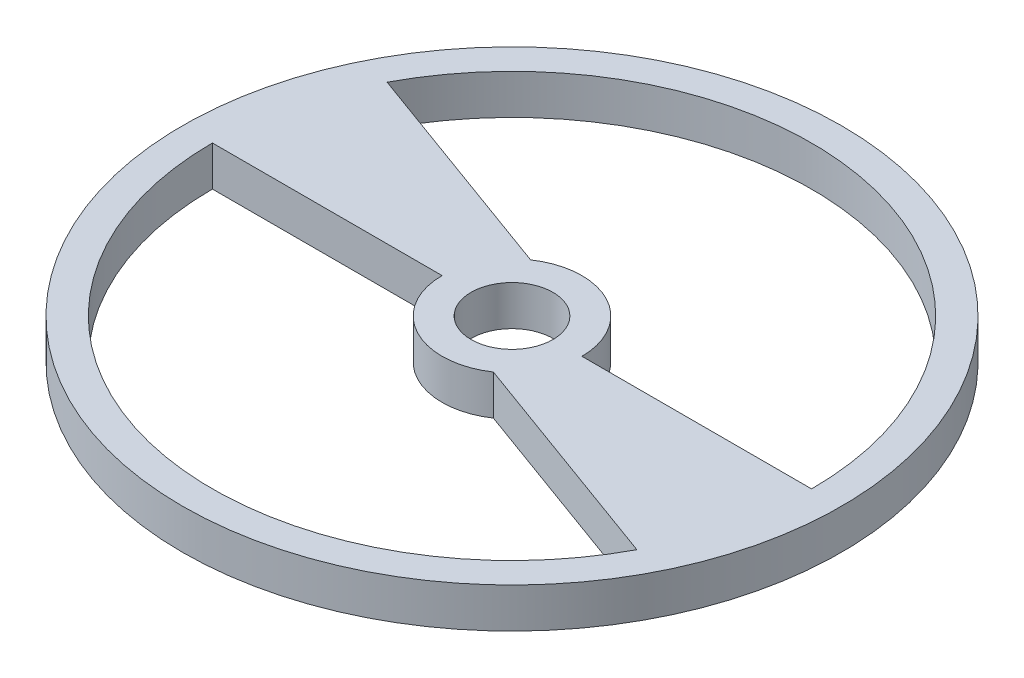
ISO-10303-21;
HEADER;
FILE_DESCRIPTION(('STEP AP214'),'2;1');
FILE_NAME('part.step','',(''),(''),'','','');
FILE_SCHEMA(('AUTOMOTIVE_DESIGN { 1 0 10303 214 1 1 1 1 }'));
ENDSEC;
DATA;
#1=APPLICATION_CONTEXT('core data for automotive mechanical design processes');
#2=APPLICATION_PROTOCOL_DEFINITION('international standard','automotive_design',2000,#1);
#3=PRODUCT_CONTEXT('',#1,'mechanical');
#4=PRODUCT('Part','Part','',(#3));
#5=PRODUCT_RELATED_PRODUCT_CATEGORY('part','',(#4));
#6=PRODUCT_DEFINITION_FORMATION('','',#4);
#7=PRODUCT_DEFINITION_CONTEXT('part definition',#1,'design');
#8=PRODUCT_DEFINITION('design','',#6,#7);
#9=PRODUCT_DEFINITION_SHAPE('','',#8);
#10=(LENGTH_UNIT() NAMED_UNIT(*) SI_UNIT(.MILLI.,.METRE.));
#11=(NAMED_UNIT(*) PLANE_ANGLE_UNIT() SI_UNIT($,.RADIAN.));
#12=(NAMED_UNIT(*) SI_UNIT($,.STERADIAN.) SOLID_ANGLE_UNIT());
#13=UNCERTAINTY_MEASURE_WITH_UNIT(LENGTH_MEASURE(1.E-05),#10,'distance_accuracy_value','');
#14=(GEOMETRIC_REPRESENTATION_CONTEXT(3) GLOBAL_UNCERTAINTY_ASSIGNED_CONTEXT((#13)) GLOBAL_UNIT_ASSIGNED_CONTEXT((#10,
#11,#12)) REPRESENTATION_CONTEXT('',''));
#15=CARTESIAN_POINT('',(0.,0.,0.));
#16=DIRECTION('',(0.,0.,1.));
#17=DIRECTION('',(1.,0.,0.));
#18=AXIS2_PLACEMENT_3D('',#15,#16,#17);
#19=CARTESIAN_POINT('',(0.,2.,0.));
#20=DIRECTION('',(0.,1.,0.));
#21=DIRECTION('',(0.,0.,1.));
#22=AXIS2_PLACEMENT_3D('',#19,#20,#21);
#23=PLANE('',#22);
#24=CARTESIAN_POINT('',(0.,2.,0.));
#25=DIRECTION('',(0.,1.,0.));
#26=DIRECTION('',(0.,0.,1.));
#27=AXIS2_PLACEMENT_3D('',#24,#25,#26);
#28=CIRCLE('',#27,16.5);
#29=CARTESIAN_POINT('',(0.,2.,16.5));
#30=VERTEX_POINT('',#29);
#31=EDGE_CURVE('E11',#30,#30,#28,.T.);
#32=ORIENTED_EDGE('',*,*,#31,.T.);
#33=EDGE_LOOP('',(#32));
#34=FACE_BOUND('',#33,.T.);
#35=CARTESIAN_POINT('',(0.,2.,0.));
#36=DIRECTION('',(0.,1.,0.));
#37=DIRECTION('',(0.,0.,1.));
#38=AXIS2_PLACEMENT_3D('',#35,#36,#37);
#39=CIRCLE('',#38,2.05);
#40=CARTESIAN_POINT('',(0.,2.,2.05));
#41=VERTEX_POINT('',#40);
#42=EDGE_CURVE('E169',#41,#41,#39,.T.);
#43=ORIENTED_EDGE('',*,*,#42,.F.);
#44=EDGE_LOOP('',(#43));
#45=FACE_BOUND('',#44,.T.);
#46=DIRECTION('',(-1.,0.,0.));
#47=VECTOR('',#46,1.);
#48=CARTESIAN_POINT('',(-3.5,2.,0.));
#49=LINE('',#48,#47);
#50=CARTESIAN_POINT('',(-3.5,2.,0.));
#51=VERTEX_POINT('',#50);
#52=CARTESIAN_POINT('',(-15.,2.,0.));
#53=VERTEX_POINT('',#52);
#54=EDGE_CURVE('E140',#51,#53,#49,.T.);
#55=ORIENTED_EDGE('',*,*,#54,.F.);
#56=CARTESIAN_POINT('',(0.,2.,0.));
#57=DIRECTION('',(0.,-1.,0.));
#58=DIRECTION('',(0.,0.,1.));
#59=AXIS2_PLACEMENT_3D('',#56,#57,#58);
#60=CIRCLE('',#59,3.5);
#61=CARTESIAN_POINT('',(1.96458962433597,2.,2.89661657938213));
#62=VERTEX_POINT('',#61);
#63=EDGE_CURVE('E138',#62,#51,#60,.T.);
#64=ORIENTED_EDGE('',*,*,#63,.F.);
#65=DIRECTION('',(-0.939692620785908,0.,-0.342020143325669));
#66=VECTOR('',#65,1.);
#67=CARTESIAN_POINT('',(1.96458962433597,2.,2.89661657938213));
#68=LINE('',#67,#66);
#69=CARTESIAN_POINT('',(13.2619922715674,2.,7.00853486749457));
#70=VERTEX_POINT('',#69);
#71=EDGE_CURVE('E146',#70,#62,#68,.T.);
#72=ORIENTED_EDGE('',*,*,#71,.F.);
#73=CARTESIAN_POINT('',(0.,2.,0.));
#74=DIRECTION('',(0.,1.,0.));
#75=DIRECTION('',(0.,0.,1.));
#76=AXIS2_PLACEMENT_3D('',#73,#74,#75);
#77=CIRCLE('',#76,15.);
#78=EDGE_CURVE('E143',#53,#70,#77,.T.);
#79=ORIENTED_EDGE('',*,*,#78,.F.);
#80=EDGE_LOOP('',(#55,#64,#72,#79));
#81=FACE_BOUND('',#80,.T.);
#82=DIRECTION('',(0.939692620785911,0.,0.342020143325663));
#83=VECTOR('',#82,1.);
#84=CARTESIAN_POINT('',(-13.2619922715674,2.,-7.00853486749448));
#85=LINE('',#84,#83);
#86=CARTESIAN_POINT('',(-13.2619922715674,2.,-7.00853486749448));
#87=VERTEX_POINT('',#86);
#88=CARTESIAN_POINT('',(-1.96458962433599,2.,-2.89661657938212));
#89=VERTEX_POINT('',#88);
#90=EDGE_CURVE('E110',#87,#89,#85,.T.);
#91=ORIENTED_EDGE('',*,*,#90,.F.);
#92=CARTESIAN_POINT('',(0.,2.,0.));
#93=DIRECTION('',(0.,1.,0.));
#94=DIRECTION('',(0.,0.,1.));
#95=AXIS2_PLACEMENT_3D('',#92,#93,#94);
#96=CIRCLE('',#95,15.);
#97=CARTESIAN_POINT('',(15.,2.,0.));
#98=VERTEX_POINT('',#97);
#99=EDGE_CURVE('E102',#98,#87,#96,.T.);
#100=ORIENTED_EDGE('',*,*,#99,.F.);
#101=DIRECTION('',(1.,0.,0.));
#102=VECTOR('',#101,1.);
#103=CARTESIAN_POINT('',(3.5,2.,0.));
#104=LINE('',#103,#102);
#105=CARTESIAN_POINT('',(3.5,2.,0.));
#106=VERTEX_POINT('',#105);
#107=EDGE_CURVE('E124',#106,#98,#104,.T.);
#108=ORIENTED_EDGE('',*,*,#107,.F.);
#109=CARTESIAN_POINT('',(0.,2.,0.));
#110=DIRECTION('',(0.,-1.,0.));
#111=DIRECTION('',(0.,0.,1.));
#112=AXIS2_PLACEMENT_3D('',#109,#110,#111);
#113=CIRCLE('',#112,3.5);
#114=EDGE_CURVE('E122',#89,#106,#113,.T.);
#115=ORIENTED_EDGE('',*,*,#114,.F.);
#116=EDGE_LOOP('',(#91,#100,#108,#115));
#117=FACE_BOUND('',#116,.T.);
#118=ADVANCED_FACE('F37',(#34,#45,#81,#117),#23,.T.);
#119=CARTESIAN_POINT('',(0.,0.,0.));
#120=DIRECTION('',(0.,1.,0.));
#121=DIRECTION('',(0.,0.,1.));
#122=AXIS2_PLACEMENT_3D('',#119,#120,#121);
#123=PLANE('',#122);
#124=CARTESIAN_POINT('',(0.,0.,0.));
#125=DIRECTION('',(0.,-1.,0.));
#126=DIRECTION('',(0.,0.,1.));
#127=AXIS2_PLACEMENT_3D('',#124,#125,#126);
#128=CIRCLE('',#127,3.5);
#129=CARTESIAN_POINT('',(1.96458962433597,0.,2.89661657938213));
#130=VERTEX_POINT('',#129);
#131=CARTESIAN_POINT('',(-3.5,0.,0.));
#132=VERTEX_POINT('',#131);
#133=EDGE_CURVE('E118',#130,#132,#128,.T.);
#134=ORIENTED_EDGE('',*,*,#133,.T.);
#135=DIRECTION('',(-1.,0.,0.));
#136=VECTOR('',#135,1.);
#137=CARTESIAN_POINT('',(-3.5,0.,0.));
#138=LINE('',#137,#136);
#139=CARTESIAN_POINT('',(-15.,0.,0.));
#140=VERTEX_POINT('',#139);
#141=EDGE_CURVE('E151',#132,#140,#138,.T.);
#142=ORIENTED_EDGE('',*,*,#141,.T.);
#143=CARTESIAN_POINT('',(0.,0.,0.));
#144=DIRECTION('',(0.,1.,0.));
#145=DIRECTION('',(0.,0.,1.));
#146=AXIS2_PLACEMENT_3D('',#143,#144,#145);
#147=CIRCLE('',#146,15.);
#148=CARTESIAN_POINT('',(13.2619922715674,0.,7.00853486749457));
#149=VERTEX_POINT('',#148);
#150=EDGE_CURVE('E154',#140,#149,#147,.T.);
#151=ORIENTED_EDGE('',*,*,#150,.T.);
#152=DIRECTION('',(-0.939692620785908,0.,-0.342020143325669));
#153=VECTOR('',#152,1.);
#154=CARTESIAN_POINT('',(1.96458962433597,0.,2.89661657938213));
#155=LINE('',#154,#153);
#156=EDGE_CURVE('E141',#149,#130,#155,.T.);
#157=ORIENTED_EDGE('',*,*,#156,.T.);
#158=EDGE_LOOP('',(#134,#142,#151,#157));
#159=FACE_BOUND('',#158,.T.);
#160=CARTESIAN_POINT('',(0.,0.,0.));
#161=DIRECTION('',(0.,1.,0.));
#162=DIRECTION('',(0.,0.,1.));
#163=AXIS2_PLACEMENT_3D('',#160,#161,#162);
#164=CIRCLE('',#163,16.5);
#165=CARTESIAN_POINT('',(0.,0.,16.5));
#166=VERTEX_POINT('',#165);
#167=EDGE_CURVE('E41',#166,#166,#164,.T.);
#168=ORIENTED_EDGE('',*,*,#167,.F.);
#169=EDGE_LOOP('',(#168));
#170=FACE_BOUND('',#169,.T.);
#171=CARTESIAN_POINT('',(0.,0.,0.));
#172=DIRECTION('',(0.,1.,0.));
#173=DIRECTION('',(0.,0.,1.));
#174=AXIS2_PLACEMENT_3D('',#171,#172,#173);
#175=CIRCLE('',#174,2.05);
#176=CARTESIAN_POINT('',(0.,0.,2.05));
#177=VERTEX_POINT('',#176);
#178=EDGE_CURVE('E168',#177,#177,#175,.T.);
#179=ORIENTED_EDGE('',*,*,#178,.T.);
#180=EDGE_LOOP('',(#179));
#181=FACE_BOUND('',#180,.T.);
#182=CARTESIAN_POINT('',(0.,0.,0.));
#183=DIRECTION('',(0.,1.,0.));
#184=DIRECTION('',(0.,0.,1.));
#185=AXIS2_PLACEMENT_3D('',#182,#183,#184);
#186=CIRCLE('',#185,15.);
#187=CARTESIAN_POINT('',(15.,0.,0.));
#188=VERTEX_POINT('',#187);
#189=CARTESIAN_POINT('',(-13.2619922715674,0.,-7.00853486749448));
#190=VERTEX_POINT('',#189);
#191=EDGE_CURVE('E60',#188,#190,#186,.T.);
#192=ORIENTED_EDGE('',*,*,#191,.T.);
#193=DIRECTION('',(0.939692620785911,0.,0.342020143325663));
#194=VECTOR('',#193,1.);
#195=CARTESIAN_POINT('',(-13.2619922715674,0.,-7.00853486749448));
#196=LINE('',#195,#194);
#197=CARTESIAN_POINT('',(-1.96458962433599,0.,-2.89661657938212));
#198=VERTEX_POINT('',#197);
#199=EDGE_CURVE('E117',#190,#198,#196,.T.);
#200=ORIENTED_EDGE('',*,*,#199,.T.);
#201=CARTESIAN_POINT('',(0.,0.,0.));
#202=DIRECTION('',(0.,-1.,0.));
#203=DIRECTION('',(0.,0.,1.));
#204=AXIS2_PLACEMENT_3D('',#201,#202,#203);
#205=CIRCLE('',#204,3.5);
#206=CARTESIAN_POINT('',(3.5,0.,0.));
#207=VERTEX_POINT('',#206);
#208=EDGE_CURVE('E130',#198,#207,#205,.T.);
#209=ORIENTED_EDGE('',*,*,#208,.T.);
#210=DIRECTION('',(1.,0.,0.));
#211=VECTOR('',#210,1.);
#212=CARTESIAN_POINT('',(3.5,0.,0.));
#213=LINE('',#212,#211);
#214=EDGE_CURVE('E111',#207,#188,#213,.T.);
#215=ORIENTED_EDGE('',*,*,#214,.T.);
#216=EDGE_LOOP('',(#192,#200,#209,#215));
#217=FACE_BOUND('',#216,.T.);
#218=ADVANCED_FACE('F175',(#159,#170,#181,#217),#123,.F.);
#219=CARTESIAN_POINT('',(0.,2.,0.));
#220=DIRECTION('',(0.,-1.,0.));
#221=DIRECTION('',(0.,0.,-1.));
#222=AXIS2_PLACEMENT_3D('',#219,#220,#221);
#223=CYLINDRICAL_SURFACE('',#222,16.5);
#224=ORIENTED_EDGE('',*,*,#31,.F.);
#225=EDGE_LOOP('',(#224));
#226=FACE_BOUND('',#225,.T.);
#227=ORIENTED_EDGE('',*,*,#167,.T.);
#228=EDGE_LOOP('',(#227));
#229=FACE_BOUND('',#228,.T.);
#230=ADVANCED_FACE('F39',(#226,#229),#223,.T.);
#231=CARTESIAN_POINT('',(0.,2.,0.));
#232=DIRECTION('',(0.,-1.,0.));
#233=DIRECTION('',(0.,0.,-1.));
#234=AXIS2_PLACEMENT_3D('',#231,#232,#233);
#235=CYLINDRICAL_SURFACE('',#234,2.05);
#236=ORIENTED_EDGE('',*,*,#42,.T.);
#237=EDGE_LOOP('',(#236));
#238=FACE_BOUND('',#237,.T.);
#239=ORIENTED_EDGE('',*,*,#178,.F.);
#240=EDGE_LOOP('',(#239));
#241=FACE_BOUND('',#240,.T.);
#242=ADVANCED_FACE('F178',(#238,#241),#235,.F.);
#243=CARTESIAN_POINT('',(0.,2.,0.));
#244=DIRECTION('',(0.,-1.,0.));
#245=DIRECTION('',(0.,0.,-1.));
#246=AXIS2_PLACEMENT_3D('',#243,#244,#245);
#247=CYLINDRICAL_SURFACE('',#246,3.5);
#248=ORIENTED_EDGE('',*,*,#133,.F.);
#249=DIRECTION('',(0.,-1.,0.));
#250=VECTOR('',#249,1.);
#251=CARTESIAN_POINT('',(1.96458962433597,2.,2.89661657938213));
#252=LINE('',#251,#250);
#253=EDGE_CURVE('E148',#62,#130,#252,.T.);
#254=ORIENTED_EDGE('',*,*,#253,.F.);
#255=ORIENTED_EDGE('',*,*,#63,.T.);
#256=DIRECTION('',(0.,-1.,0.));
#257=VECTOR('',#256,1.);
#258=CARTESIAN_POINT('',(-3.5,2.,0.));
#259=LINE('',#258,#257);
#260=EDGE_CURVE('E165',#51,#132,#259,.T.);
#261=ORIENTED_EDGE('',*,*,#260,.T.);
#262=EDGE_LOOP('',(#248,#254,#255,#261));
#263=FACE_BOUND('',#262,.T.);
#264=ADVANCED_FACE('F180',(#263),#247,.T.);
#265=CARTESIAN_POINT('',(-3.5,2.,0.));
#266=DIRECTION('',(0.,0.,1.));
#267=DIRECTION('',(1.,0.,0.));
#268=AXIS2_PLACEMENT_3D('',#265,#266,#267);
#269=PLANE('',#268);
#270=ORIENTED_EDGE('',*,*,#141,.F.);
#271=ORIENTED_EDGE('',*,*,#260,.F.);
#272=ORIENTED_EDGE('',*,*,#54,.T.);
#273=DIRECTION('',(0.,-1.,0.));
#274=VECTOR('',#273,1.);
#275=CARTESIAN_POINT('',(-15.,2.,0.));
#276=LINE('',#275,#274);
#277=EDGE_CURVE('E163',#53,#140,#276,.T.);
#278=ORIENTED_EDGE('',*,*,#277,.T.);
#279=EDGE_LOOP('',(#270,#271,#272,#278));
#280=FACE_BOUND('',#279,.T.);
#281=ADVANCED_FACE('F187',(#280),#269,.T.);
#282=CARTESIAN_POINT('',(0.,2.,0.));
#283=DIRECTION('',(0.,-1.,0.));
#284=DIRECTION('',(0.,0.,-1.));
#285=AXIS2_PLACEMENT_3D('',#282,#283,#284);
#286=CYLINDRICAL_SURFACE('',#285,15.);
#287=ORIENTED_EDGE('',*,*,#150,.F.);
#288=ORIENTED_EDGE('',*,*,#277,.F.);
#289=ORIENTED_EDGE('',*,*,#78,.T.);
#290=DIRECTION('',(0.,-1.,0.));
#291=VECTOR('',#290,1.);
#292=CARTESIAN_POINT('',(13.2619922715674,2.,7.00853486749457));
#293=LINE('',#292,#291);
#294=EDGE_CURVE('E161',#70,#149,#293,.T.);
#295=ORIENTED_EDGE('',*,*,#294,.T.);
#296=EDGE_LOOP('',(#287,#288,#289,#295));
#297=FACE_BOUND('',#296,.T.);
#298=ADVANCED_FACE('F211',(#297),#286,.F.);
#299=CARTESIAN_POINT('',(1.96458962433597,2.,2.89661657938213));
#300=DIRECTION('',(-0.342020143325669,0.,0.939692620785908));
#301=DIRECTION('',(0.939692620785908,0.,0.342020143325669));
#302=AXIS2_PLACEMENT_3D('',#299,#300,#301);
#303=PLANE('',#302);
#304=ORIENTED_EDGE('',*,*,#156,.F.);
#305=ORIENTED_EDGE('',*,*,#294,.F.);
#306=ORIENTED_EDGE('',*,*,#71,.T.);
#307=ORIENTED_EDGE('',*,*,#253,.T.);
#308=EDGE_LOOP('',(#304,#305,#306,#307));
#309=FACE_BOUND('',#308,.T.);
#310=ADVANCED_FACE('F216',(#309),#303,.T.);
#311=CARTESIAN_POINT('',(0.,2.,0.));
#312=DIRECTION('',(0.,-1.,0.));
#313=DIRECTION('',(0.,0.,-1.));
#314=AXIS2_PLACEMENT_3D('',#311,#312,#313);
#315=CYLINDRICAL_SURFACE('',#314,15.);
#316=ORIENTED_EDGE('',*,*,#191,.F.);
#317=DIRECTION('',(0.,-1.,0.));
#318=VECTOR('',#317,1.);
#319=CARTESIAN_POINT('',(15.,2.,0.));
#320=LINE('',#319,#318);
#321=EDGE_CURVE('E106',#98,#188,#320,.T.);
#322=ORIENTED_EDGE('',*,*,#321,.F.);
#323=ORIENTED_EDGE('',*,*,#99,.T.);
#324=DIRECTION('',(0.,-1.,0.));
#325=VECTOR('',#324,1.);
#326=CARTESIAN_POINT('',(-13.2619922715674,2.,-7.00853486749448));
#327=LINE('',#326,#325);
#328=EDGE_CURVE('E105',#87,#190,#327,.T.);
#329=ORIENTED_EDGE('',*,*,#328,.T.);
#330=EDGE_LOOP('',(#316,#322,#323,#329));
#331=FACE_BOUND('',#330,.T.);
#332=ADVANCED_FACE('F104',(#331),#315,.F.);
#333=CARTESIAN_POINT('',(-13.2619922715674,2.,-7.00853486749448));
#334=DIRECTION('',(0.342020143325663,0.,-0.939692620785911));
#335=DIRECTION('',(-0.939692620785911,0.,-0.342020143325663));
#336=AXIS2_PLACEMENT_3D('',#333,#334,#335);
#337=PLANE('',#336);
#338=ORIENTED_EDGE('',*,*,#199,.F.);
#339=ORIENTED_EDGE('',*,*,#328,.F.);
#340=ORIENTED_EDGE('',*,*,#90,.T.);
#341=DIRECTION('',(0.,-1.,0.));
#342=VECTOR('',#341,1.);
#343=CARTESIAN_POINT('',(-1.96458962433599,2.,-2.89661657938212));
#344=LINE('',#343,#342);
#345=EDGE_CURVE('E119',#89,#198,#344,.T.);
#346=ORIENTED_EDGE('',*,*,#345,.T.);
#347=EDGE_LOOP('',(#338,#339,#340,#346));
#348=FACE_BOUND('',#347,.T.);
#349=ADVANCED_FACE('F114',(#348),#337,.T.);
#350=CARTESIAN_POINT('',(0.,2.,0.));
#351=DIRECTION('',(0.,-1.,0.));
#352=DIRECTION('',(0.,0.,-1.));
#353=AXIS2_PLACEMENT_3D('',#350,#351,#352);
#354=CYLINDRICAL_SURFACE('',#353,3.5);
#355=ORIENTED_EDGE('',*,*,#208,.F.);
#356=ORIENTED_EDGE('',*,*,#345,.F.);
#357=ORIENTED_EDGE('',*,*,#114,.T.);
#358=DIRECTION('',(0.,-1.,0.));
#359=VECTOR('',#358,1.);
#360=CARTESIAN_POINT('',(3.5,2.,0.));
#361=LINE('',#360,#359);
#362=EDGE_CURVE('E52',#106,#207,#361,.T.);
#363=ORIENTED_EDGE('',*,*,#362,.T.);
#364=EDGE_LOOP('',(#355,#356,#357,#363));
#365=FACE_BOUND('',#364,.T.);
#366=ADVANCED_FACE('F258',(#365),#354,.T.);
#367=CARTESIAN_POINT('',(3.5,2.,0.));
#368=DIRECTION('',(0.,0.,-1.));
#369=DIRECTION('',(-1.,0.,0.));
#370=AXIS2_PLACEMENT_3D('',#367,#368,#369);
#371=PLANE('',#370);
#372=ORIENTED_EDGE('',*,*,#214,.F.);
#373=ORIENTED_EDGE('',*,*,#362,.F.);
#374=ORIENTED_EDGE('',*,*,#107,.T.);
#375=ORIENTED_EDGE('',*,*,#321,.T.);
#376=EDGE_LOOP('',(#372,#373,#374,#375));
#377=FACE_BOUND('',#376,.T.);
#378=ADVANCED_FACE('F267',(#377),#371,.T.);
#379=CLOSED_SHELL('',(#118,#218,#230,#242,#264,#281,#298,#310,#332,#349,#366,#378));
#380=MANIFOLD_SOLID_BREP('B2',#379);
#381=ADVANCED_BREP_SHAPE_REPRESENTATION('',(#18,#380),#14);
#382=SHAPE_DEFINITION_REPRESENTATION(#9,#381);
ENDSEC;
END-ISO-10303-21;
